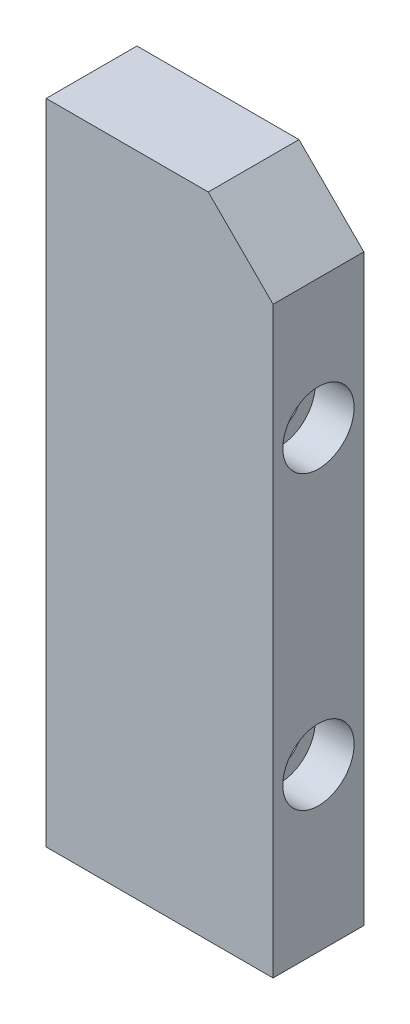
ISO-10303-21;
HEADER;
FILE_DESCRIPTION(('STEP AP214'),'2;1');
FILE_NAME('part.step','',(''),(''),'','','');
FILE_SCHEMA(('AUTOMOTIVE_DESIGN { 1 0 10303 214 1 1 1 1 }'));
ENDSEC;
DATA;
#1=APPLICATION_CONTEXT('core data for automotive mechanical design processes');
#2=APPLICATION_PROTOCOL_DEFINITION('international standard','automotive_design',2000,#1);
#3=PRODUCT_CONTEXT('',#1,'mechanical');
#4=PRODUCT('Part','Part','',(#3));
#5=PRODUCT_RELATED_PRODUCT_CATEGORY('part','',(#4));
#6=PRODUCT_DEFINITION_FORMATION('','',#4);
#7=PRODUCT_DEFINITION_CONTEXT('part definition',#1,'design');
#8=PRODUCT_DEFINITION('design','',#6,#7);
#9=PRODUCT_DEFINITION_SHAPE('','',#8);
#10=(LENGTH_UNIT() NAMED_UNIT(*) SI_UNIT(.MILLI.,.METRE.));
#11=(NAMED_UNIT(*) PLANE_ANGLE_UNIT() SI_UNIT($,.RADIAN.));
#12=(NAMED_UNIT(*) SI_UNIT($,.STERADIAN.) SOLID_ANGLE_UNIT());
#13=UNCERTAINTY_MEASURE_WITH_UNIT(LENGTH_MEASURE(1.E-05),#10,'distance_accuracy_value','');
#14=(GEOMETRIC_REPRESENTATION_CONTEXT(3) GLOBAL_UNCERTAINTY_ASSIGNED_CONTEXT((#13)) GLOBAL_UNIT_ASSIGNED_CONTEXT((#10,
#11,#12)) REPRESENTATION_CONTEXT('',''));
#15=CARTESIAN_POINT('',(0.,0.,0.));
#16=DIRECTION('',(0.,0.,1.));
#17=DIRECTION('',(1.,0.,0.));
#18=AXIS2_PLACEMENT_3D('',#15,#16,#17);
#19=CARTESIAN_POINT('',(0.,0.,14.));
#20=DIRECTION('',(1.,0.,0.));
#21=DIRECTION('',(0.,0.,-1.));
#22=AXIS2_PLACEMENT_3D('',#19,#20,#21);
#23=PLANE('',#22);
#24=CARTESIAN_POINT('',(0.,70.,7.));
#25=DIRECTION('',(1.,0.,0.));
#26=DIRECTION('',(0.,0.,-1.));
#27=AXIS2_PLACEMENT_3D('',#24,#25,#26);
#28=CIRCLE('',#27,3.24999999999999);
#29=CARTESIAN_POINT('',(0.,70.,3.75000000000001));
#30=VERTEX_POINT('',#29);
#31=EDGE_CURVE('E108',#30,#30,#28,.T.);
#32=ORIENTED_EDGE('',*,*,#31,.T.);
#33=EDGE_LOOP('',(#32));
#34=FACE_BOUND('',#33,.T.);
#35=CARTESIAN_POINT('',(0.,25.,7.));
#36=DIRECTION('',(1.,0.,0.));
#37=DIRECTION('',(0.,0.,-1.));
#38=AXIS2_PLACEMENT_3D('',#35,#36,#37);
#39=CIRCLE('',#38,3.24999999999999);
#40=CARTESIAN_POINT('',(0.,25.,3.75000000000001));
#41=VERTEX_POINT('',#40);
#42=EDGE_CURVE('E120',#41,#41,#39,.T.);
#43=ORIENTED_EDGE('',*,*,#42,.T.);
#44=EDGE_LOOP('',(#43));
#45=FACE_BOUND('',#44,.T.);
#46=DIRECTION('',(0.,-1.,0.));
#47=VECTOR('',#46,1.);
#48=CARTESIAN_POINT('',(0.,0.,0.));
#49=LINE('',#48,#47);
#50=CARTESIAN_POINT('',(0.,100.,0.));
#51=VERTEX_POINT('',#50);
#52=CARTESIAN_POINT('',(0.,0.,0.));
#53=VERTEX_POINT('',#52);
#54=EDGE_CURVE('E123',#51,#53,#49,.T.);
#55=ORIENTED_EDGE('',*,*,#54,.T.);
#56=DIRECTION('',(0.,0.,-1.));
#57=VECTOR('',#56,1.);
#58=CARTESIAN_POINT('',(0.,0.,14.));
#59=LINE('',#58,#57);
#60=CARTESIAN_POINT('',(0.,0.,14.));
#61=VERTEX_POINT('',#60);
#62=EDGE_CURVE('E147',#61,#53,#59,.T.);
#63=ORIENTED_EDGE('',*,*,#62,.F.);
#64=DIRECTION('',(0.,-1.,0.));
#65=VECTOR('',#64,1.);
#66=CARTESIAN_POINT('',(0.,0.,14.));
#67=LINE('',#66,#65);
#68=CARTESIAN_POINT('',(0.,100.,14.));
#69=VERTEX_POINT('',#68);
#70=EDGE_CURVE('E124',#69,#61,#67,.T.);
#71=ORIENTED_EDGE('',*,*,#70,.F.);
#72=DIRECTION('',(0.,0.,-1.));
#73=VECTOR('',#72,1.);
#74=CARTESIAN_POINT('',(0.,100.,14.));
#75=LINE('',#74,#73);
#76=EDGE_CURVE('E134',#69,#51,#75,.T.);
#77=ORIENTED_EDGE('',*,*,#76,.T.);
#78=EDGE_LOOP('',(#55,#63,#71,#77));
#79=FACE_BOUND('',#78,.T.);
#80=ADVANCED_FACE('F36',(#34,#45,#79),#23,.F.);
#81=CARTESIAN_POINT('',(0.,0.,14.));
#82=DIRECTION('',(0.,1.,0.));
#83=DIRECTION('',(0.,0.,1.));
#84=AXIS2_PLACEMENT_3D('',#81,#82,#83);
#85=PLANE('',#84);
#86=CARTESIAN_POINT('',(17.5,0.,6.99999999999984));
#87=DIRECTION('',(0.,-1.,0.));
#88=DIRECTION('',(0.,0.,-1.));
#89=AXIS2_PLACEMENT_3D('',#86,#87,#88);
#90=CIRCLE('',#89,2.49999999999999);
#91=CARTESIAN_POINT('',(17.5,0.,4.49999999999985));
#92=VERTEX_POINT('',#91);
#93=EDGE_CURVE('E95',#92,#92,#90,.T.);
#94=ORIENTED_EDGE('',*,*,#93,.F.);
#95=EDGE_LOOP('',(#94));
#96=FACE_BOUND('',#95,.T.);
#97=DIRECTION('',(1.,0.,0.));
#98=VECTOR('',#97,1.);
#99=CARTESIAN_POINT('',(0.,0.,0.));
#100=LINE('',#99,#98);
#101=CARTESIAN_POINT('',(35.,0.,0.));
#102=VERTEX_POINT('',#101);
#103=EDGE_CURVE('E137',#53,#102,#100,.T.);
#104=ORIENTED_EDGE('',*,*,#103,.T.);
#105=DIRECTION('',(0.,0.,-1.));
#106=VECTOR('',#105,1.);
#107=CARTESIAN_POINT('',(35.,0.,14.));
#108=LINE('',#107,#106);
#109=CARTESIAN_POINT('',(35.,0.,14.));
#110=VERTEX_POINT('',#109);
#111=EDGE_CURVE('E144',#110,#102,#108,.T.);
#112=ORIENTED_EDGE('',*,*,#111,.F.);
#113=DIRECTION('',(1.,0.,0.));
#114=VECTOR('',#113,1.);
#115=CARTESIAN_POINT('',(0.,0.,14.));
#116=LINE('',#115,#114);
#117=EDGE_CURVE('E127',#61,#110,#116,.T.);
#118=ORIENTED_EDGE('',*,*,#117,.F.);
#119=ORIENTED_EDGE('',*,*,#62,.T.);
#120=EDGE_LOOP('',(#104,#112,#118,#119));
#121=FACE_BOUND('',#120,.T.);
#122=ADVANCED_FACE('F179',(#96,#121),#85,.F.);
#123=CARTESIAN_POINT('',(35.,0.,14.));
#124=DIRECTION('',(-1.,0.,0.));
#125=DIRECTION('',(0.,0.,1.));
#126=AXIS2_PLACEMENT_3D('',#123,#124,#125);
#127=PLANE('',#126);
#128=CARTESIAN_POINT('',(35.,70.,7.));
#129=DIRECTION('',(1.,0.,0.));
#130=DIRECTION('',(0.,0.,-1.));
#131=AXIS2_PLACEMENT_3D('',#128,#129,#130);
#132=CIRCLE('',#131,5.49999999999999);
#133=CARTESIAN_POINT('',(35.,70.,1.50000000000001));
#134=VERTEX_POINT('',#133);
#135=EDGE_CURVE('E94',#134,#134,#132,.T.);
#136=ORIENTED_EDGE('',*,*,#135,.F.);
#137=EDGE_LOOP('',(#136));
#138=FACE_BOUND('',#137,.T.);
#139=CARTESIAN_POINT('',(35.,25.,7.));
#140=DIRECTION('',(1.,0.,0.));
#141=DIRECTION('',(0.,0.,-1.));
#142=AXIS2_PLACEMENT_3D('',#139,#140,#141);
#143=CIRCLE('',#142,5.49999999999999);
#144=CARTESIAN_POINT('',(35.,25.,1.50000000000001));
#145=VERTEX_POINT('',#144);
#146=EDGE_CURVE('E111',#145,#145,#143,.T.);
#147=ORIENTED_EDGE('',*,*,#146,.F.);
#148=EDGE_LOOP('',(#147));
#149=FACE_BOUND('',#148,.T.);
#150=DIRECTION('',(0.,1.,0.));
#151=VECTOR('',#150,1.);
#152=CARTESIAN_POINT('',(35.,0.,0.));
#153=LINE('',#152,#151);
#154=CARTESIAN_POINT('',(35.,90.,0.));
#155=VERTEX_POINT('',#154);
#156=EDGE_CURVE('E139',#102,#155,#153,.T.);
#157=ORIENTED_EDGE('',*,*,#156,.T.);
#158=DIRECTION('',(0.,0.,1.));
#159=VECTOR('',#158,1.);
#160=CARTESIAN_POINT('',(35.,90.,14.));
#161=LINE('',#160,#159);
#162=CARTESIAN_POINT('',(35.,89.9999999999999,14.));
#163=VERTEX_POINT('',#162);
#164=EDGE_CURVE('E44',#155,#163,#161,.T.);
#165=ORIENTED_EDGE('',*,*,#164,.T.);
#166=DIRECTION('',(0.,1.,0.));
#167=VECTOR('',#166,1.);
#168=CARTESIAN_POINT('',(35.,0.,14.));
#169=LINE('',#168,#167);
#170=EDGE_CURVE('E130',#110,#163,#169,.T.);
#171=ORIENTED_EDGE('',*,*,#170,.F.);
#172=ORIENTED_EDGE('',*,*,#111,.T.);
#173=EDGE_LOOP('',(#157,#165,#171,#172));
#174=FACE_BOUND('',#173,.T.);
#175=ADVANCED_FACE('F184',(#138,#149,#174),#127,.F.);
#176=CARTESIAN_POINT('',(0.,100.,14.));
#177=DIRECTION('',(0.,-1.,0.));
#178=DIRECTION('',(0.,0.,-1.));
#179=AXIS2_PLACEMENT_3D('',#176,#177,#178);
#180=PLANE('',#179);
#181=DIRECTION('',(-1.,0.,0.));
#182=VECTOR('',#181,1.);
#183=CARTESIAN_POINT('',(0.,100.,14.));
#184=LINE('',#183,#182);
#185=CARTESIAN_POINT('',(25.,100.,14.));
#186=VERTEX_POINT('',#185);
#187=EDGE_CURVE('E132',#186,#69,#184,.T.);
#188=ORIENTED_EDGE('',*,*,#187,.F.);
#189=DIRECTION('',(0.,0.,-1.));
#190=VECTOR('',#189,1.);
#191=CARTESIAN_POINT('',(25.,100.,14.));
#192=LINE('',#191,#190);
#193=CARTESIAN_POINT('',(25.,100.,0.));
#194=VERTEX_POINT('',#193);
#195=EDGE_CURVE('E150',#186,#194,#192,.T.);
#196=ORIENTED_EDGE('',*,*,#195,.T.);
#197=DIRECTION('',(-1.,0.,0.));
#198=VECTOR('',#197,1.);
#199=CARTESIAN_POINT('',(0.,100.,0.));
#200=LINE('',#199,#198);
#201=EDGE_CURVE('E128',#194,#51,#200,.T.);
#202=ORIENTED_EDGE('',*,*,#201,.T.);
#203=ORIENTED_EDGE('',*,*,#76,.F.);
#204=EDGE_LOOP('',(#188,#196,#202,#203));
#205=FACE_BOUND('',#204,.T.);
#206=ADVANCED_FACE('F156',(#205),#180,.F.);
#207=CARTESIAN_POINT('',(0.,0.,14.));
#208=DIRECTION('',(0.,0.,-1.));
#209=DIRECTION('',(-1.,0.,0.));
#210=AXIS2_PLACEMENT_3D('',#207,#208,#209);
#211=PLANE('',#210);
#212=ORIENTED_EDGE('',*,*,#170,.T.);
#213=DIRECTION('',(0.707106781186547,-0.707106781186549,0.));
#214=VECTOR('',#213,1.);
#215=CARTESIAN_POINT('',(25.,100.,14.));
#216=LINE('',#215,#214);
#217=EDGE_CURVE('E11',#163,#186,#216,.F.);
#218=ORIENTED_EDGE('',*,*,#217,.T.);
#219=ORIENTED_EDGE('',*,*,#187,.T.);
#220=ORIENTED_EDGE('',*,*,#70,.T.);
#221=ORIENTED_EDGE('',*,*,#117,.T.);
#222=EDGE_LOOP('',(#212,#218,#219,#220,#221));
#223=FACE_BOUND('',#222,.T.);
#224=ADVANCED_FACE('F166',(#223),#211,.F.);
#225=CARTESIAN_POINT('',(0.,0.,0.));
#226=DIRECTION('',(0.,0.,-1.));
#227=DIRECTION('',(-1.,0.,0.));
#228=AXIS2_PLACEMENT_3D('',#225,#226,#227);
#229=PLANE('',#228);
#230=ORIENTED_EDGE('',*,*,#201,.F.);
#231=DIRECTION('',(-0.707106781186547,0.707106781186549,0.));
#232=VECTOR('',#231,1.);
#233=CARTESIAN_POINT('',(62.5,62.4999999999999,0.));
#234=LINE('',#233,#232);
#235=EDGE_CURVE('E58',#194,#155,#234,.F.);
#236=ORIENTED_EDGE('',*,*,#235,.T.);
#237=ORIENTED_EDGE('',*,*,#156,.F.);
#238=ORIENTED_EDGE('',*,*,#103,.F.);
#239=ORIENTED_EDGE('',*,*,#54,.F.);
#240=EDGE_LOOP('',(#230,#236,#237,#238,#239));
#241=FACE_BOUND('',#240,.T.);
#242=ADVANCED_FACE('F161',(#241),#229,.T.);
#243=CARTESIAN_POINT('',(25.,100.,14.));
#244=DIRECTION('',(-0.707106781186548,-0.707106781186546,0.));
#245=DIRECTION('',(0.,0.,-1.));
#246=AXIS2_PLACEMENT_3D('',#243,#244,#245);
#247=PLANE('',#246);
#248=ORIENTED_EDGE('',*,*,#217,.F.);
#249=ORIENTED_EDGE('',*,*,#164,.F.);
#250=ORIENTED_EDGE('',*,*,#235,.F.);
#251=ORIENTED_EDGE('',*,*,#195,.F.);
#252=EDGE_LOOP('',(#248,#249,#250,#251));
#253=FACE_BOUND('',#252,.T.);
#254=ADVANCED_FACE('F38',(#253),#247,.F.);
#255=CARTESIAN_POINT('',(35.,25.,7.));
#256=DIRECTION('',(1.,0.,0.));
#257=DIRECTION('',(0.,0.,-1.));
#258=AXIS2_PLACEMENT_3D('',#255,#256,#257);
#259=CYLINDRICAL_SURFACE('',#258,3.25);
#260=ORIENTED_EDGE('',*,*,#42,.F.);
#261=EDGE_LOOP('',(#260));
#262=FACE_BOUND('',#261,.T.);
#263=CARTESIAN_POINT('',(29.,25.,7.));
#264=DIRECTION('',(1.,0.,0.));
#265=DIRECTION('',(0.,0.,-1.));
#266=AXIS2_PLACEMENT_3D('',#263,#264,#265);
#267=CIRCLE('',#266,3.25);
#268=CARTESIAN_POINT('',(29.,25.,3.75));
#269=VERTEX_POINT('',#268);
#270=EDGE_CURVE('E117',#269,#269,#267,.T.);
#271=ORIENTED_EDGE('',*,*,#270,.T.);
#272=EDGE_LOOP('',(#271));
#273=FACE_BOUND('',#272,.T.);
#274=ADVANCED_FACE('F169',(#262,#273),#259,.F.);
#275=CARTESIAN_POINT('',(29.,28.25,7.));
#276=DIRECTION('',(-1.,0.,0.));
#277=DIRECTION('',(0.,0.,1.));
#278=AXIS2_PLACEMENT_3D('',#275,#276,#277);
#279=PLANE('',#278);
#280=ORIENTED_EDGE('',*,*,#270,.F.);
#281=EDGE_LOOP('',(#280));
#282=FACE_BOUND('',#281,.T.);
#283=CARTESIAN_POINT('',(29.,25.,7.));
#284=DIRECTION('',(1.,0.,0.));
#285=DIRECTION('',(0.,0.,-1.));
#286=AXIS2_PLACEMENT_3D('',#283,#284,#285);
#287=CIRCLE('',#286,5.5);
#288=CARTESIAN_POINT('',(29.,25.,1.5));
#289=VERTEX_POINT('',#288);
#290=EDGE_CURVE('E114',#289,#289,#287,.T.);
#291=ORIENTED_EDGE('',*,*,#290,.T.);
#292=EDGE_LOOP('',(#291));
#293=FACE_BOUND('',#292,.T.);
#294=ADVANCED_FACE('F174',(#282,#293),#279,.F.);
#295=CARTESIAN_POINT('',(35.,25.,7.));
#296=DIRECTION('',(1.,0.,0.));
#297=DIRECTION('',(0.,0.,-1.));
#298=AXIS2_PLACEMENT_3D('',#295,#296,#297);
#299=CYLINDRICAL_SURFACE('',#298,5.5);
#300=ORIENTED_EDGE('',*,*,#290,.F.);
#301=EDGE_LOOP('',(#300));
#302=FACE_BOUND('',#301,.T.);
#303=ORIENTED_EDGE('',*,*,#146,.T.);
#304=EDGE_LOOP('',(#303));
#305=FACE_BOUND('',#304,.T.);
#306=ADVANCED_FACE('F198',(#302,#305),#299,.F.);
#307=CARTESIAN_POINT('',(35.,70.,7.));
#308=DIRECTION('',(1.,0.,0.));
#309=DIRECTION('',(0.,0.,-1.));
#310=AXIS2_PLACEMENT_3D('',#307,#308,#309);
#311=CYLINDRICAL_SURFACE('',#310,3.25);
#312=ORIENTED_EDGE('',*,*,#31,.F.);
#313=EDGE_LOOP('',(#312));
#314=FACE_BOUND('',#313,.T.);
#315=CARTESIAN_POINT('',(29.,70.,7.));
#316=DIRECTION('',(1.,0.,0.));
#317=DIRECTION('',(0.,0.,-1.));
#318=AXIS2_PLACEMENT_3D('',#315,#316,#317);
#319=CIRCLE('',#318,3.25);
#320=CARTESIAN_POINT('',(29.,70.,3.75));
#321=VERTEX_POINT('',#320);
#322=EDGE_CURVE('E105',#321,#321,#319,.T.);
#323=ORIENTED_EDGE('',*,*,#322,.T.);
#324=EDGE_LOOP('',(#323));
#325=FACE_BOUND('',#324,.T.);
#326=ADVANCED_FACE('F202',(#314,#325),#311,.F.);
#327=CARTESIAN_POINT('',(29.,73.25,7.));
#328=DIRECTION('',(-1.,0.,0.));
#329=DIRECTION('',(0.,0.,1.));
#330=AXIS2_PLACEMENT_3D('',#327,#328,#329);
#331=PLANE('',#330);
#332=ORIENTED_EDGE('',*,*,#322,.F.);
#333=EDGE_LOOP('',(#332));
#334=FACE_BOUND('',#333,.T.);
#335=CARTESIAN_POINT('',(29.,70.,7.));
#336=DIRECTION('',(1.,0.,0.));
#337=DIRECTION('',(0.,0.,-1.));
#338=AXIS2_PLACEMENT_3D('',#335,#336,#337);
#339=CIRCLE('',#338,5.50000000000001);
#340=CARTESIAN_POINT('',(29.,70.,1.5));
#341=VERTEX_POINT('',#340);
#342=EDGE_CURVE('E98',#341,#341,#339,.T.);
#343=ORIENTED_EDGE('',*,*,#342,.T.);
#344=EDGE_LOOP('',(#343));
#345=FACE_BOUND('',#344,.T.);
#346=ADVANCED_FACE('F206',(#334,#345),#331,.F.);
#347=CARTESIAN_POINT('',(35.,70.,7.));
#348=DIRECTION('',(1.,0.,0.));
#349=DIRECTION('',(0.,0.,-1.));
#350=AXIS2_PLACEMENT_3D('',#347,#348,#349);
#351=CYLINDRICAL_SURFACE('',#350,5.5);
#352=ORIENTED_EDGE('',*,*,#342,.F.);
#353=EDGE_LOOP('',(#352));
#354=FACE_BOUND('',#353,.T.);
#355=ORIENTED_EDGE('',*,*,#135,.T.);
#356=EDGE_LOOP('',(#355));
#357=FACE_BOUND('',#356,.T.);
#358=ADVANCED_FACE('F88',(#354,#357),#351,.F.);
#359=CARTESIAN_POINT('',(17.5,17.,6.99999999999984));
#360=DIRECTION('',(0.,-1.,0.));
#361=DIRECTION('',(0.,0.,-1.));
#362=AXIS2_PLACEMENT_3D('',#359,#360,#361);
#363=CONICAL_SURFACE('',#362,2.49999999999998,1.02974425867665);
#364=CARTESIAN_POINT('',(17.5,18.5021515475689,6.99999999999984));
#365=VERTEX_POINT('',#364);
#366=VERTEX_LOOP('',#365);
#367=FACE_BOUND('',#366,.T.);
#368=CARTESIAN_POINT('',(17.5,17.,6.99999999999984));
#369=DIRECTION('',(0.,-1.,0.));
#370=DIRECTION('',(0.,0.,-1.));
#371=AXIS2_PLACEMENT_3D('',#368,#369,#370);
#372=CIRCLE('',#371,2.49999999999998);
#373=CARTESIAN_POINT('',(17.5,17.,4.49999999999985));
#374=VERTEX_POINT('',#373);
#375=EDGE_CURVE('E92',#374,#374,#372,.T.);
#376=ORIENTED_EDGE('',*,*,#375,.T.);
#377=EDGE_LOOP('',(#376));
#378=FACE_BOUND('',#377,.T.);
#379=ADVANCED_FACE('F84',(#367,#378),#363,.F.);
#380=CARTESIAN_POINT('',(17.5,0.,6.99999999999984));
#381=DIRECTION('',(0.,-1.,0.));
#382=DIRECTION('',(0.,0.,-1.));
#383=AXIS2_PLACEMENT_3D('',#380,#381,#382);
#384=CYLINDRICAL_SURFACE('',#383,2.49999999999999);
#385=ORIENTED_EDGE('',*,*,#375,.F.);
#386=EDGE_LOOP('',(#385));
#387=FACE_BOUND('',#386,.T.);
#388=ORIENTED_EDGE('',*,*,#93,.T.);
#389=EDGE_LOOP('',(#388));
#390=FACE_BOUND('',#389,.T.);
#391=ADVANCED_FACE('F87',(#387,#390),#384,.F.);
#392=CLOSED_SHELL('',(#80,#122,#175,#206,#224,#242,#254,#274,#294,#306,#326,#346,#358,#379,#391));
#393=MANIFOLD_SOLID_BREP('B2',#392);
#394=ADVANCED_BREP_SHAPE_REPRESENTATION('',(#18,#393),#14);
#395=SHAPE_DEFINITION_REPRESENTATION(#9,#394);
ENDSEC;
END-ISO-10303-21;
